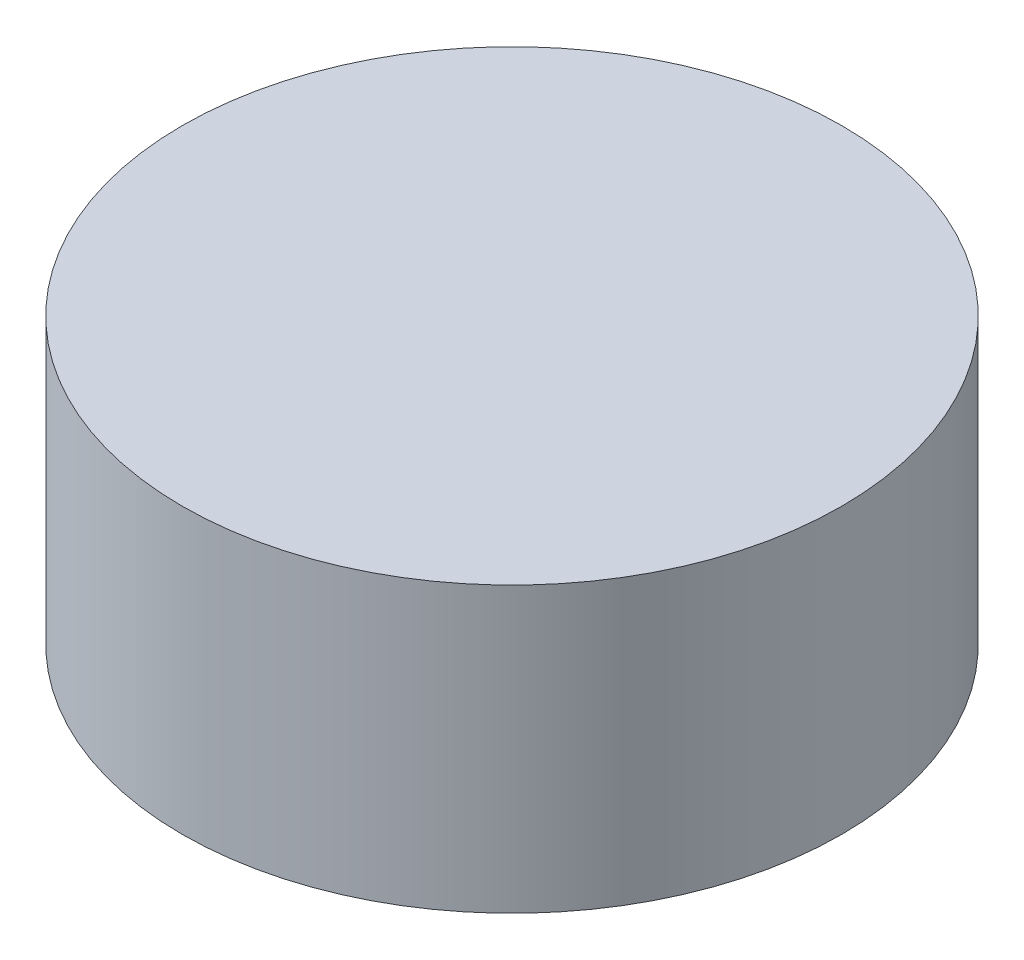
ISO-10303-21;
HEADER;
FILE_DESCRIPTION(('STEP AP214'),'2;1');
FILE_NAME('part.step','',(''),(''),'','','');
FILE_SCHEMA(('AUTOMOTIVE_DESIGN { 1 0 10303 214 1 1 1 1 }'));
ENDSEC;
DATA;
#1=APPLICATION_CONTEXT('core data for automotive mechanical design processes');
#2=APPLICATION_PROTOCOL_DEFINITION('international standard','automotive_design',2000,#1);
#3=PRODUCT_CONTEXT('',#1,'mechanical');
#4=PRODUCT('Part','Part','',(#3));
#5=PRODUCT_RELATED_PRODUCT_CATEGORY('part','',(#4));
#6=PRODUCT_DEFINITION_FORMATION('','',#4);
#7=PRODUCT_DEFINITION_CONTEXT('part definition',#1,'design');
#8=PRODUCT_DEFINITION('design','',#6,#7);
#9=PRODUCT_DEFINITION_SHAPE('','',#8);
#10=(LENGTH_UNIT() NAMED_UNIT(*) SI_UNIT(.MILLI.,.METRE.));
#11=(NAMED_UNIT(*) PLANE_ANGLE_UNIT() SI_UNIT($,.RADIAN.));
#12=(NAMED_UNIT(*) SI_UNIT($,.STERADIAN.) SOLID_ANGLE_UNIT());
#13=UNCERTAINTY_MEASURE_WITH_UNIT(LENGTH_MEASURE(1.E-05),#10,'distance_accuracy_value','');
#14=(GEOMETRIC_REPRESENTATION_CONTEXT(3) GLOBAL_UNCERTAINTY_ASSIGNED_CONTEXT((#13)) GLOBAL_UNIT_ASSIGNED_CONTEXT((#10,
#11,#12)) REPRESENTATION_CONTEXT('',''));
#15=CARTESIAN_POINT('',(0.,0.,0.));
#16=DIRECTION('',(0.,0.,1.));
#17=DIRECTION('',(1.,0.,0.));
#18=AXIS2_PLACEMENT_3D('',#15,#16,#17);
#19=CARTESIAN_POINT('',(0.,25.,0.));
#20=DIRECTION('',(0.,-1.,0.));
#21=DIRECTION('',(0.,0.,-1.));
#22=AXIS2_PLACEMENT_3D('',#19,#20,#21);
#23=CYLINDRICAL_SURFACE('',#22,29.);
#24=CARTESIAN_POINT('',(0.,25.,0.));
#25=DIRECTION('',(0.,1.,0.));
#26=DIRECTION('',(0.,0.,1.));
#27=AXIS2_PLACEMENT_3D('',#24,#25,#26);
#28=CIRCLE('',#27,29.);
#29=CARTESIAN_POINT('',(0.,25.,29.));
#30=VERTEX_POINT('',#29);
#31=EDGE_CURVE('E10',#30,#30,#28,.T.);
#32=ORIENTED_EDGE('',*,*,#31,.F.);
#33=EDGE_LOOP('',(#32));
#34=FACE_BOUND('',#33,.T.);
#35=CARTESIAN_POINT('',(0.,0.,0.));
#36=DIRECTION('',(0.,1.,0.));
#37=DIRECTION('',(0.,0.,1.));
#38=AXIS2_PLACEMENT_3D('',#35,#36,#37);
#39=CIRCLE('',#38,29.);
#40=CARTESIAN_POINT('',(0.,0.,29.));
#41=VERTEX_POINT('',#40);
#42=EDGE_CURVE('E34',#41,#41,#39,.T.);
#43=ORIENTED_EDGE('',*,*,#42,.T.);
#44=EDGE_LOOP('',(#43));
#45=FACE_BOUND('',#44,.T.);
#46=ADVANCED_FACE('F31',(#34,#45),#23,.T.);
#47=CARTESIAN_POINT('',(0.,25.,0.));
#48=DIRECTION('',(0.,1.,0.));
#49=DIRECTION('',(0.,0.,1.));
#50=AXIS2_PLACEMENT_3D('',#47,#48,#49);
#51=PLANE('',#50);
#52=ORIENTED_EDGE('',*,*,#31,.T.);
#53=EDGE_LOOP('',(#52));
#54=FACE_BOUND('',#53,.T.);
#55=ADVANCED_FACE('F46',(#54),#51,.T.);
#56=CARTESIAN_POINT('',(0.,0.,0.));
#57=DIRECTION('',(0.,1.,0.));
#58=DIRECTION('',(0.,0.,1.));
#59=AXIS2_PLACEMENT_3D('',#56,#57,#58);
#60=PLANE('',#59);
#61=ORIENTED_EDGE('',*,*,#42,.F.);
#62=EDGE_LOOP('',(#61));
#63=FACE_BOUND('',#62,.T.);
#64=ADVANCED_FACE('F44',(#63),#60,.F.);
#65=CLOSED_SHELL('',(#46,#55,#64));
#66=MANIFOLD_SOLID_BREP('B2',#65);
#67=ADVANCED_BREP_SHAPE_REPRESENTATION('',(#18,#66),#14);
#68=SHAPE_DEFINITION_REPRESENTATION(#9,#67);
ENDSEC;
END-ISO-10303-21;
